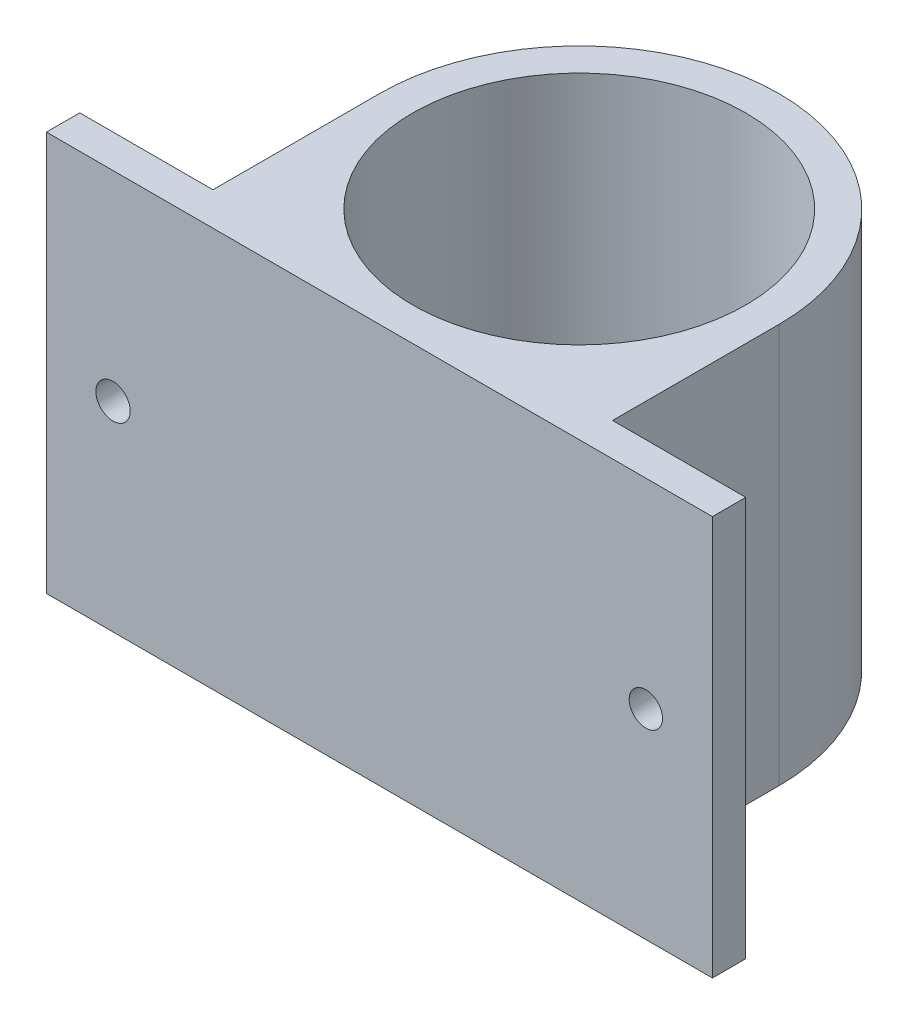
ISO-10303-21;
HEADER;
FILE_DESCRIPTION(('STEP AP214'),'2;1');
FILE_NAME('part.step','',(''),(''),'','','');
FILE_SCHEMA(('AUTOMOTIVE_DESIGN { 1 0 10303 214 1 1 1 1 }'));
ENDSEC;
DATA;
#1=APPLICATION_CONTEXT('core data for automotive mechanical design processes');
#2=APPLICATION_PROTOCOL_DEFINITION('international standard','automotive_design',2000,#1);
#3=PRODUCT_CONTEXT('',#1,'mechanical');
#4=PRODUCT('Part','Part','',(#3));
#5=PRODUCT_RELATED_PRODUCT_CATEGORY('part','',(#4));
#6=PRODUCT_DEFINITION_FORMATION('','',#4);
#7=PRODUCT_DEFINITION_CONTEXT('part definition',#1,'design');
#8=PRODUCT_DEFINITION('design','',#6,#7);
#9=PRODUCT_DEFINITION_SHAPE('','',#8);
#10=(LENGTH_UNIT() NAMED_UNIT(*) SI_UNIT(.MILLI.,.METRE.));
#11=(NAMED_UNIT(*) PLANE_ANGLE_UNIT() SI_UNIT($,.RADIAN.));
#12=(NAMED_UNIT(*) SI_UNIT($,.STERADIAN.) SOLID_ANGLE_UNIT());
#13=UNCERTAINTY_MEASURE_WITH_UNIT(LENGTH_MEASURE(1.E-05),#10,'distance_accuracy_value','');
#14=(GEOMETRIC_REPRESENTATION_CONTEXT(3) GLOBAL_UNCERTAINTY_ASSIGNED_CONTEXT((#13)) GLOBAL_UNIT_ASSIGNED_CONTEXT((#10,
#11,#12)) REPRESENTATION_CONTEXT('',''));
#15=CARTESIAN_POINT('',(0.,0.,0.));
#16=DIRECTION('',(0.,0.,1.));
#17=DIRECTION('',(1.,0.,0.));
#18=AXIS2_PLACEMENT_3D('',#15,#16,#17);
#19=CARTESIAN_POINT('',(0.,76.2,31.75));
#20=DIRECTION('',(0.,0.,-1.));
#21=DIRECTION('',(-1.,0.,0.));
#22=AXIS2_PLACEMENT_3D('',#19,#20,#21);
#23=PLANE('',#22);
#24=CARTESIAN_POINT('',(50.8,38.1,31.75));
#25=DIRECTION('',(0.,0.,-1.));
#26=DIRECTION('',(-1.,0.,0.));
#27=AXIS2_PLACEMENT_3D('',#24,#25,#26);
#28=CIRCLE('',#27,3.17500000000001);
#29=CARTESIAN_POINT('',(47.625,38.1,31.75));
#30=VERTEX_POINT('',#29);
#31=EDGE_CURVE('E201',#30,#30,#28,.T.);
#32=ORIENTED_EDGE('',*,*,#31,.F.);
#33=EDGE_LOOP('',(#32));
#34=FACE_BOUND('',#33,.T.);
#35=DIRECTION('',(1.,0.,0.));
#36=VECTOR('',#35,1.);
#37=CARTESIAN_POINT('',(0.,0.,31.75));
#38=LINE('',#37,#36);
#39=CARTESIAN_POINT('',(38.1,0.,31.75));
#40=VERTEX_POINT('',#39);
#41=CARTESIAN_POINT('',(63.5,0.,31.75));
#42=VERTEX_POINT('',#41);
#43=EDGE_CURVE('E145',#40,#42,#38,.T.);
#44=ORIENTED_EDGE('',*,*,#43,.F.);
#45=DIRECTION('',(0.,-1.,0.));
#46=VECTOR('',#45,1.);
#47=CARTESIAN_POINT('',(38.1,76.2,31.75));
#48=LINE('',#47,#46);
#49=CARTESIAN_POINT('',(38.1,76.2,31.75));
#50=VERTEX_POINT('',#49);
#51=EDGE_CURVE('E11',#50,#40,#48,.T.);
#52=ORIENTED_EDGE('',*,*,#51,.F.);
#53=DIRECTION('',(1.,0.,0.));
#54=VECTOR('',#53,1.);
#55=CARTESIAN_POINT('',(0.,76.2,31.75));
#56=LINE('',#55,#54);
#57=CARTESIAN_POINT('',(63.5,76.2,31.75));
#58=VERTEX_POINT('',#57);
#59=EDGE_CURVE('E176',#50,#58,#56,.T.);
#60=ORIENTED_EDGE('',*,*,#59,.T.);
#61=DIRECTION('',(0.,-1.,0.));
#62=VECTOR('',#61,1.);
#63=CARTESIAN_POINT('',(63.5,76.2,31.75));
#64=LINE('',#63,#62);
#65=EDGE_CURVE('E60',#58,#42,#64,.T.);
#66=ORIENTED_EDGE('',*,*,#65,.T.);
#67=EDGE_LOOP('',(#44,#52,#60,#66));
#68=FACE_BOUND('',#67,.T.);
#69=ADVANCED_FACE('F41',(#34,#68),#23,.T.);
#70=CARTESIAN_POINT('',(38.1,76.2,0.));
#71=DIRECTION('',(1.,0.,0.));
#72=DIRECTION('',(0.,0.,-1.));
#73=AXIS2_PLACEMENT_3D('',#70,#71,#72);
#74=PLANE('',#73);
#75=DIRECTION('',(0.,0.,1.));
#76=VECTOR('',#75,1.);
#77=CARTESIAN_POINT('',(38.1,0.,0.));
#78=LINE('',#77,#76);
#79=CARTESIAN_POINT('',(38.1,0.,0.));
#80=VERTEX_POINT('',#79);
#81=EDGE_CURVE('E148',#80,#40,#78,.T.);
#82=ORIENTED_EDGE('',*,*,#81,.F.);
#83=DIRECTION('',(0.,-1.,0.));
#84=VECTOR('',#83,1.);
#85=CARTESIAN_POINT('',(38.1,76.2,0.));
#86=LINE('',#85,#84);
#87=CARTESIAN_POINT('',(38.1,76.2,0.));
#88=VERTEX_POINT('',#87);
#89=EDGE_CURVE('E51',#88,#80,#86,.T.);
#90=ORIENTED_EDGE('',*,*,#89,.F.);
#91=DIRECTION('',(0.,0.,1.));
#92=VECTOR('',#91,1.);
#93=CARTESIAN_POINT('',(38.1,76.2,0.));
#94=LINE('',#93,#92);
#95=EDGE_CURVE('E211',#88,#50,#94,.T.);
#96=ORIENTED_EDGE('',*,*,#95,.T.);
#97=ORIENTED_EDGE('',*,*,#51,.T.);
#98=EDGE_LOOP('',(#82,#90,#96,#97));
#99=FACE_BOUND('',#98,.T.);
#100=ADVANCED_FACE('F242',(#99),#74,.T.);
#101=CARTESIAN_POINT('',(0.,76.2,0.));
#102=DIRECTION('',(0.,-1.,0.));
#103=DIRECTION('',(0.,0.,-1.));
#104=AXIS2_PLACEMENT_3D('',#101,#102,#103);
#105=CYLINDRICAL_SURFACE('',#104,38.1);
#106=CARTESIAN_POINT('',(0.,0.,0.));
#107=DIRECTION('',(0.,1.,0.));
#108=DIRECTION('',(0.,0.,1.));
#109=AXIS2_PLACEMENT_3D('',#106,#107,#108);
#110=CIRCLE('',#109,38.1);
#111=CARTESIAN_POINT('',(-38.1,0.,0.));
#112=VERTEX_POINT('',#111);
#113=EDGE_CURVE('E152',#80,#112,#110,.T.);
#114=ORIENTED_EDGE('',*,*,#113,.T.);
#115=DIRECTION('',(0.,-1.,0.));
#116=VECTOR('',#115,1.);
#117=CARTESIAN_POINT('',(-38.1,76.2,0.));
#118=LINE('',#117,#116);
#119=CARTESIAN_POINT('',(-38.1,76.2,0.));
#120=VERTEX_POINT('',#119);
#121=EDGE_CURVE('E186',#120,#112,#118,.T.);
#122=ORIENTED_EDGE('',*,*,#121,.F.);
#123=CARTESIAN_POINT('',(0.,76.2,0.));
#124=DIRECTION('',(0.,1.,0.));
#125=DIRECTION('',(0.,0.,1.));
#126=AXIS2_PLACEMENT_3D('',#123,#124,#125);
#127=CIRCLE('',#126,38.1);
#128=EDGE_CURVE('E215',#88,#120,#127,.T.);
#129=ORIENTED_EDGE('',*,*,#128,.F.);
#130=ORIENTED_EDGE('',*,*,#89,.T.);
#131=EDGE_LOOP('',(#114,#122,#129,#130));
#132=FACE_BOUND('',#131,.T.);
#133=ADVANCED_FACE('F247',(#132),#105,.T.);
#134=CARTESIAN_POINT('',(-38.1,76.2,0.));
#135=DIRECTION('',(1.,0.,0.));
#136=DIRECTION('',(0.,0.,-1.));
#137=AXIS2_PLACEMENT_3D('',#134,#135,#136);
#138=PLANE('',#137);
#139=DIRECTION('',(0.,0.,1.));
#140=VECTOR('',#139,1.);
#141=CARTESIAN_POINT('',(-38.1,0.,0.));
#142=LINE('',#141,#140);
#143=CARTESIAN_POINT('',(-38.1,0.,31.75));
#144=VERTEX_POINT('',#143);
#145=EDGE_CURVE('E155',#112,#144,#142,.T.);
#146=ORIENTED_EDGE('',*,*,#145,.T.);
#147=DIRECTION('',(0.,-1.,0.));
#148=VECTOR('',#147,1.);
#149=CARTESIAN_POINT('',(-38.1,76.2,31.75));
#150=LINE('',#149,#148);
#151=CARTESIAN_POINT('',(-38.1,76.2,31.75));
#152=VERTEX_POINT('',#151);
#153=EDGE_CURVE('E183',#152,#144,#150,.T.);
#154=ORIENTED_EDGE('',*,*,#153,.F.);
#155=DIRECTION('',(0.,0.,1.));
#156=VECTOR('',#155,1.);
#157=CARTESIAN_POINT('',(-38.1,76.2,0.));
#158=LINE('',#157,#156);
#159=EDGE_CURVE('E218',#120,#152,#158,.T.);
#160=ORIENTED_EDGE('',*,*,#159,.F.);
#161=ORIENTED_EDGE('',*,*,#121,.T.);
#162=EDGE_LOOP('',(#146,#154,#160,#161));
#163=FACE_BOUND('',#162,.T.);
#164=ADVANCED_FACE('F258',(#163),#138,.F.);
#165=CARTESIAN_POINT('',(0.,76.2,31.75));
#166=DIRECTION('',(0.,0.,-1.));
#167=DIRECTION('',(-1.,0.,0.));
#168=AXIS2_PLACEMENT_3D('',#165,#166,#167);
#169=PLANE('',#168);
#170=CARTESIAN_POINT('',(-50.8,38.1,31.75));
#171=DIRECTION('',(0.,0.,-1.));
#172=DIRECTION('',(-1.,0.,0.));
#173=AXIS2_PLACEMENT_3D('',#170,#171,#172);
#174=CIRCLE('',#173,3.2766);
#175=CARTESIAN_POINT('',(-54.0766,38.1,31.75));
#176=VERTEX_POINT('',#175);
#177=EDGE_CURVE('E194',#176,#176,#174,.T.);
#178=ORIENTED_EDGE('',*,*,#177,.F.);
#179=EDGE_LOOP('',(#178));
#180=FACE_BOUND('',#179,.T.);
#181=DIRECTION('',(1.,0.,0.));
#182=VECTOR('',#181,1.);
#183=CARTESIAN_POINT('',(0.,0.,31.75));
#184=LINE('',#183,#182);
#185=CARTESIAN_POINT('',(-63.5,0.,31.75));
#186=VERTEX_POINT('',#185);
#187=EDGE_CURVE('E159',#186,#144,#184,.T.);
#188=ORIENTED_EDGE('',*,*,#187,.F.);
#189=DIRECTION('',(0.,-1.,0.));
#190=VECTOR('',#189,1.);
#191=CARTESIAN_POINT('',(-63.5,76.2,31.75));
#192=LINE('',#191,#190);
#193=CARTESIAN_POINT('',(-63.5,76.2,31.75));
#194=VERTEX_POINT('',#193);
#195=EDGE_CURVE('E131',#194,#186,#192,.T.);
#196=ORIENTED_EDGE('',*,*,#195,.F.);
#197=DIRECTION('',(1.,0.,0.));
#198=VECTOR('',#197,1.);
#199=CARTESIAN_POINT('',(0.,76.2,31.75));
#200=LINE('',#199,#198);
#201=EDGE_CURVE('E119',#194,#152,#200,.T.);
#202=ORIENTED_EDGE('',*,*,#201,.T.);
#203=ORIENTED_EDGE('',*,*,#153,.T.);
#204=EDGE_LOOP('',(#188,#196,#202,#203));
#205=FACE_BOUND('',#204,.T.);
#206=ADVANCED_FACE('F223',(#180,#205),#169,.T.);
#207=CARTESIAN_POINT('',(-63.5,76.2,0.));
#208=DIRECTION('',(1.,0.,0.));
#209=DIRECTION('',(0.,0.,-1.));
#210=AXIS2_PLACEMENT_3D('',#207,#208,#209);
#211=PLANE('',#210);
#212=DIRECTION('',(0.,0.,1.));
#213=VECTOR('',#212,1.);
#214=CARTESIAN_POINT('',(-63.5,0.,0.));
#215=LINE('',#214,#213);
#216=CARTESIAN_POINT('',(-63.5,0.,38.1));
#217=VERTEX_POINT('',#216);
#218=EDGE_CURVE('E127',#186,#217,#215,.T.);
#219=ORIENTED_EDGE('',*,*,#218,.T.);
#220=DIRECTION('',(0.,-1.,0.));
#221=VECTOR('',#220,1.);
#222=CARTESIAN_POINT('',(-63.5,76.2,38.1));
#223=LINE('',#222,#221);
#224=CARTESIAN_POINT('',(-63.5,76.2,38.1));
#225=VERTEX_POINT('',#224);
#226=EDGE_CURVE('E124',#225,#217,#223,.T.);
#227=ORIENTED_EDGE('',*,*,#226,.F.);
#228=DIRECTION('',(0.,0.,1.));
#229=VECTOR('',#228,1.);
#230=CARTESIAN_POINT('',(-63.5,76.2,0.));
#231=LINE('',#230,#229);
#232=EDGE_CURVE('E111',#194,#225,#231,.T.);
#233=ORIENTED_EDGE('',*,*,#232,.F.);
#234=ORIENTED_EDGE('',*,*,#195,.T.);
#235=EDGE_LOOP('',(#219,#227,#233,#234));
#236=FACE_BOUND('',#235,.T.);
#237=ADVANCED_FACE('F125',(#236),#211,.F.);
#238=CARTESIAN_POINT('',(0.,76.2,38.1));
#239=DIRECTION('',(0.,0.,-1.));
#240=DIRECTION('',(-1.,0.,0.));
#241=AXIS2_PLACEMENT_3D('',#238,#239,#240);
#242=PLANE('',#241);
#243=CARTESIAN_POINT('',(-50.8,38.1,38.1));
#244=DIRECTION('',(0.,0.,-1.));
#245=DIRECTION('',(-1.,0.,0.));
#246=AXIS2_PLACEMENT_3D('',#243,#244,#245);
#247=CIRCLE('',#246,3.2766);
#248=CARTESIAN_POINT('',(-54.0766,38.1,38.1));
#249=VERTEX_POINT('',#248);
#250=EDGE_CURVE('E44',#249,#249,#247,.T.);
#251=ORIENTED_EDGE('',*,*,#250,.T.);
#252=EDGE_LOOP('',(#251));
#253=FACE_BOUND('',#252,.T.);
#254=CARTESIAN_POINT('',(50.8,38.1,38.1));
#255=DIRECTION('',(0.,0.,-1.));
#256=DIRECTION('',(-1.,0.,0.));
#257=AXIS2_PLACEMENT_3D('',#254,#255,#256);
#258=CIRCLE('',#257,3.17500000000001);
#259=CARTESIAN_POINT('',(47.625,38.1,38.1));
#260=VERTEX_POINT('',#259);
#261=EDGE_CURVE('E191',#260,#260,#258,.T.);
#262=ORIENTED_EDGE('',*,*,#261,.T.);
#263=EDGE_LOOP('',(#262));
#264=FACE_BOUND('',#263,.T.);
#265=DIRECTION('',(1.,0.,0.));
#266=VECTOR('',#265,1.);
#267=CARTESIAN_POINT('',(0.,0.,38.1));
#268=LINE('',#267,#266);
#269=CARTESIAN_POINT('',(63.5,0.,38.1));
#270=VERTEX_POINT('',#269);
#271=EDGE_CURVE('E165',#217,#270,#268,.T.);
#272=ORIENTED_EDGE('',*,*,#271,.T.);
#273=DIRECTION('',(0.,-1.,0.));
#274=VECTOR('',#273,1.);
#275=CARTESIAN_POINT('',(63.5,76.2,38.1));
#276=LINE('',#275,#274);
#277=CARTESIAN_POINT('',(63.5,76.2,38.1));
#278=VERTEX_POINT('',#277);
#279=EDGE_CURVE('E86',#278,#270,#276,.T.);
#280=ORIENTED_EDGE('',*,*,#279,.F.);
#281=DIRECTION('',(1.,0.,0.));
#282=VECTOR('',#281,1.);
#283=CARTESIAN_POINT('',(0.,76.2,38.1));
#284=LINE('',#283,#282);
#285=EDGE_CURVE('E117',#225,#278,#284,.T.);
#286=ORIENTED_EDGE('',*,*,#285,.F.);
#287=ORIENTED_EDGE('',*,*,#226,.T.);
#288=EDGE_LOOP('',(#272,#280,#286,#287));
#289=FACE_BOUND('',#288,.T.);
#290=ADVANCED_FACE('F133',(#253,#264,#289),#242,.F.);
#291=CARTESIAN_POINT('',(63.5,76.2,0.));
#292=DIRECTION('',(1.,0.,0.));
#293=DIRECTION('',(0.,0.,-1.));
#294=AXIS2_PLACEMENT_3D('',#291,#292,#293);
#295=PLANE('',#294);
#296=DIRECTION('',(0.,0.,1.));
#297=VECTOR('',#296,1.);
#298=CARTESIAN_POINT('',(63.5,0.,0.));
#299=LINE('',#298,#297);
#300=EDGE_CURVE('E168',#42,#270,#299,.T.);
#301=ORIENTED_EDGE('',*,*,#300,.F.);
#302=ORIENTED_EDGE('',*,*,#65,.F.);
#303=DIRECTION('',(0.,0.,1.));
#304=VECTOR('',#303,1.);
#305=CARTESIAN_POINT('',(63.5,76.2,0.));
#306=LINE('',#305,#304);
#307=EDGE_CURVE('E135',#58,#278,#306,.T.);
#308=ORIENTED_EDGE('',*,*,#307,.T.);
#309=ORIENTED_EDGE('',*,*,#279,.T.);
#310=EDGE_LOOP('',(#301,#302,#308,#309));
#311=FACE_BOUND('',#310,.T.);
#312=ADVANCED_FACE('F229',(#311),#295,.T.);
#313=CARTESIAN_POINT('',(0.,76.2,0.));
#314=DIRECTION('',(0.,-1.,0.));
#315=DIRECTION('',(0.,0.,-1.));
#316=AXIS2_PLACEMENT_3D('',#313,#314,#315);
#317=CYLINDRICAL_SURFACE('',#316,31.75);
#318=CARTESIAN_POINT('',(0.,76.2,0.));
#319=DIRECTION('',(0.,1.,0.));
#320=DIRECTION('',(0.,0.,1.));
#321=AXIS2_PLACEMENT_3D('',#318,#319,#320);
#322=CIRCLE('',#321,31.75);
#323=CARTESIAN_POINT('',(0.,76.2,-31.75));
#324=VERTEX_POINT('',#323);
#325=EDGE_CURVE('E138',#324,#324,#322,.T.);
#326=CARTESIAN_POINT('',(0.,0.,0.));
#327=DIRECTION('',(0.,1.,0.));
#328=DIRECTION('',(0.,0.,1.));
#329=AXIS2_PLACEMENT_3D('',#326,#327,#328);
#330=CIRCLE('',#329,31.75);
#331=CARTESIAN_POINT('',(0.,0.,-31.75));
#332=VERTEX_POINT('',#331);
#333=EDGE_CURVE('E172',#332,#332,#330,.T.);
#334=CARTESIAN_POINT('',(0.,76.2,-31.75));
#335=CARTESIAN_POINT('',(0.,75.40625,-31.75));
#336=CARTESIAN_POINT('',(0.,74.6125,-31.75));
#337=CARTESIAN_POINT('',(0.,73.025,-31.75));
#338=CARTESIAN_POINT('',(0.,72.23125,-31.75));
#339=CARTESIAN_POINT('',(0.,70.64375,-31.75));
#340=CARTESIAN_POINT('',(0.,69.85,-31.75));
#341=CARTESIAN_POINT('',(0.,68.2625,-31.75));
#342=CARTESIAN_POINT('',(0.,67.46875,-31.75));
#343=CARTESIAN_POINT('',(0.,65.88125,-31.75));
#344=CARTESIAN_POINT('',(0.,65.0875,-31.75));
#345=CARTESIAN_POINT('',(0.,63.5,-31.75));
#346=CARTESIAN_POINT('',(0.,62.70625,-31.75));
#347=CARTESIAN_POINT('',(0.,61.11875,-31.75));
#348=CARTESIAN_POINT('',(0.,60.325,-31.75));
#349=CARTESIAN_POINT('',(0.,58.7375,-31.75));
#350=CARTESIAN_POINT('',(0.,57.94375,-31.75));
#351=CARTESIAN_POINT('',(0.,56.35625,-31.75));
#352=CARTESIAN_POINT('',(0.,55.5625,-31.75));
#353=CARTESIAN_POINT('',(0.,53.975,-31.75));
#354=CARTESIAN_POINT('',(0.,53.18125,-31.75));
#355=CARTESIAN_POINT('',(0.,51.59375,-31.75));
#356=CARTESIAN_POINT('',(0.,50.8,-31.75));
#357=CARTESIAN_POINT('',(0.,49.2125,-31.75));
#358=CARTESIAN_POINT('',(0.,48.41875,-31.75));
#359=CARTESIAN_POINT('',(0.,46.83125,-31.75));
#360=CARTESIAN_POINT('',(0.,46.0375,-31.75));
#361=CARTESIAN_POINT('',(0.,44.45,-31.75));
#362=CARTESIAN_POINT('',(0.,43.65625,-31.75));
#363=CARTESIAN_POINT('',(0.,42.06875,-31.75));
#364=CARTESIAN_POINT('',(0.,41.275,-31.75));
#365=CARTESIAN_POINT('',(0.,39.6875,-31.75));
#366=CARTESIAN_POINT('',(0.,38.89375,-31.75));
#367=CARTESIAN_POINT('',(0.,37.30625,-31.75));
#368=CARTESIAN_POINT('',(0.,36.5125,-31.75));
#369=CARTESIAN_POINT('',(0.,34.925,-31.75));
#370=CARTESIAN_POINT('',(0.,34.13125,-31.75));
#371=CARTESIAN_POINT('',(0.,32.54375,-31.75));
#372=CARTESIAN_POINT('',(0.,31.75,-31.75));
#373=CARTESIAN_POINT('',(0.,30.1625,-31.75));
#374=CARTESIAN_POINT('',(0.,29.36875,-31.75));
#375=CARTESIAN_POINT('',(0.,27.78125,-31.75));
#376=CARTESIAN_POINT('',(0.,26.9875,-31.75));
#377=CARTESIAN_POINT('',(0.,25.4,-31.75));
#378=CARTESIAN_POINT('',(0.,24.60625,-31.75));
#379=CARTESIAN_POINT('',(0.,23.01875,-31.75));
#380=CARTESIAN_POINT('',(0.,22.225,-31.75));
#381=CARTESIAN_POINT('',(0.,20.6375,-31.75));
#382=CARTESIAN_POINT('',(0.,19.84375,-31.75));
#383=CARTESIAN_POINT('',(0.,18.25625,-31.75));
#384=CARTESIAN_POINT('',(0.,17.4625,-31.75));
#385=CARTESIAN_POINT('',(0.,15.875,-31.75));
#386=CARTESIAN_POINT('',(0.,15.08125,-31.75));
#387=CARTESIAN_POINT('',(0.,13.49375,-31.75));
#388=CARTESIAN_POINT('',(0.,12.7,-31.75));
#389=CARTESIAN_POINT('',(0.,11.1125,-31.75));
#390=CARTESIAN_POINT('',(0.,10.31875,-31.75));
#391=CARTESIAN_POINT('',(0.,8.73125,-31.75));
#392=CARTESIAN_POINT('',(0.,7.93750000000001,-31.75));
#393=CARTESIAN_POINT('',(0.,6.35,-31.75));
#394=CARTESIAN_POINT('',(0.,5.55625,-31.75));
#395=CARTESIAN_POINT('',(0.,3.96875,-31.75));
#396=CARTESIAN_POINT('',(0.,3.175,-31.75));
#397=CARTESIAN_POINT('',(0.,1.5875,-31.75));
#398=CARTESIAN_POINT('',(0.,0.793750000000001,-31.75));
#399=CARTESIAN_POINT('',(0.,0.,-31.75));
#400=B_SPLINE_CURVE_WITH_KNOTS('',3,(#334,#335,#336,#337,#338,#339,#340,#341,#342,#343,#344,
#345,#346,#347,#348,#349,#350,#351,#352,#353,#354,#355,#356,#357,#358,#359,#360,#361,#362,#363,
#364,#365,#366,#367,#368,#369,#370,#371,#372,#373,#374,#375,#376,#377,#378,#379,#380,#381,#382,
#383,#384,#385,#386,#387,#388,#389,#390,#391,#392,#393,#394,#395,#396,#397,#398,#399),
.UNSPECIFIED.,.F.,.F.,(4,2,2,2,2,2,2,2,2,2,2,2,2,2,2,2,2,2,2,2,2,2,2,2,2,2,2,2,2,2,2,2,4),(0.,
2.38124999999999,4.76249999999999,7.14374999999999,9.52499999999999,11.90625,14.2875,16.66875,
19.05,21.43125,23.8125,26.19375,28.575,30.95625,33.3375,35.71875,38.1,40.48125,42.8625,45.24375,
47.625,50.00625,52.3875,54.76875,57.15,59.53125,61.9125,64.29375,66.675,69.05625,71.4375,
73.81875,76.2),.UNSPECIFIED.);
#401=EDGE_CURVE('BSEAM231',#324,#332,#400,.T.);
#402=ORIENTED_EDGE('',*,*,#325,.T.);
#403=ORIENTED_EDGE('',*,*,#333,.F.);
#404=ORIENTED_EDGE('',*,*,#401,.T.);
#405=ORIENTED_EDGE('',*,*,#401,.F.);
#406=EDGE_LOOP('',(#402,#404,#403,#405));
#407=FACE_BOUND('',#406,.T.);
#408=ADVANCED_FACE('F231',(#407),#317,.F.);
#409=CARTESIAN_POINT('',(0.,76.2,0.));
#410=DIRECTION('',(0.,1.,0.));
#411=DIRECTION('',(0.,0.,1.));
#412=AXIS2_PLACEMENT_3D('',#409,#410,#411);
#413=PLANE('',#412);
#414=ORIENTED_EDGE('',*,*,#59,.F.);
#415=ORIENTED_EDGE('',*,*,#95,.F.);
#416=ORIENTED_EDGE('',*,*,#128,.T.);
#417=ORIENTED_EDGE('',*,*,#159,.T.);
#418=ORIENTED_EDGE('',*,*,#201,.F.);
#419=ORIENTED_EDGE('',*,*,#232,.T.);
#420=ORIENTED_EDGE('',*,*,#285,.T.);
#421=ORIENTED_EDGE('',*,*,#307,.F.);
#422=EDGE_LOOP('',(#414,#415,#416,#417,#418,#419,#420,#421));
#423=FACE_BOUND('',#422,.T.);
#424=ORIENTED_EDGE('',*,*,#325,.F.);
#425=EDGE_LOOP('',(#424));
#426=FACE_BOUND('',#425,.T.);
#427=ADVANCED_FACE('F113',(#423,#426),#413,.T.);
#428=CARTESIAN_POINT('',(0.,0.,0.));
#429=DIRECTION('',(0.,1.,0.));
#430=DIRECTION('',(0.,0.,1.));
#431=AXIS2_PLACEMENT_3D('',#428,#429,#430);
#432=PLANE('',#431);
#433=ORIENTED_EDGE('',*,*,#43,.T.);
#434=ORIENTED_EDGE('',*,*,#300,.T.);
#435=ORIENTED_EDGE('',*,*,#271,.F.);
#436=ORIENTED_EDGE('',*,*,#218,.F.);
#437=ORIENTED_EDGE('',*,*,#187,.T.);
#438=ORIENTED_EDGE('',*,*,#145,.F.);
#439=ORIENTED_EDGE('',*,*,#113,.F.);
#440=ORIENTED_EDGE('',*,*,#81,.T.);
#441=EDGE_LOOP('',(#433,#434,#435,#436,#437,#438,#439,#440));
#442=FACE_BOUND('',#441,.T.);
#443=ORIENTED_EDGE('',*,*,#333,.T.);
#444=EDGE_LOOP('',(#443));
#445=FACE_BOUND('',#444,.T.);
#446=ADVANCED_FACE('F226',(#442,#445),#432,.F.);
#447=CARTESIAN_POINT('',(50.8,38.1,82.55));
#448=DIRECTION('',(0.,0.,-1.));
#449=DIRECTION('',(-1.,0.,0.));
#450=AXIS2_PLACEMENT_3D('',#447,#448,#449);
#451=CYLINDRICAL_SURFACE('',#450,3.17500000000001);
#452=ORIENTED_EDGE('',*,*,#31,.T.);
#453=EDGE_LOOP('',(#452));
#454=FACE_BOUND('',#453,.T.);
#455=ORIENTED_EDGE('',*,*,#261,.F.);
#456=EDGE_LOOP('',(#455));
#457=FACE_BOUND('',#456,.T.);
#458=ADVANCED_FACE('F286',(#454,#457),#451,.F.);
#459=CARTESIAN_POINT('',(-50.8,38.1,82.55));
#460=DIRECTION('',(0.,0.,-1.));
#461=DIRECTION('',(-1.,0.,0.));
#462=AXIS2_PLACEMENT_3D('',#459,#460,#461);
#463=CYLINDRICAL_SURFACE('',#462,3.2766);
#464=ORIENTED_EDGE('',*,*,#177,.T.);
#465=EDGE_LOOP('',(#464));
#466=FACE_BOUND('',#465,.T.);
#467=ORIENTED_EDGE('',*,*,#250,.F.);
#468=EDGE_LOOP('',(#467));
#469=FACE_BOUND('',#468,.T.);
#470=ADVANCED_FACE('F291',(#466,#469),#463,.F.);
#471=CLOSED_SHELL('',(#69,#100,#133,#164,#206,#237,#290,#312,#408,#427,#446,#458,#470));
#472=MANIFOLD_SOLID_BREP('B2',#471);
#473=ADVANCED_BREP_SHAPE_REPRESENTATION('',(#18,#472),#14);
#474=SHAPE_DEFINITION_REPRESENTATION(#9,#473);
ENDSEC;
END-ISO-10303-21;
